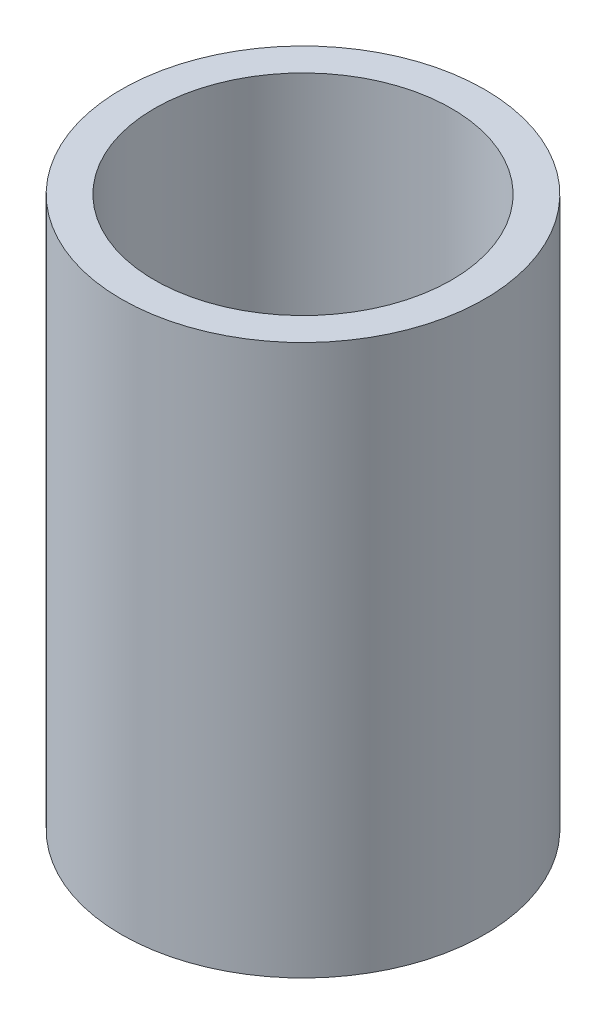
ISO-10303-21;
HEADER;
FILE_DESCRIPTION(('STEP AP214'),'2;1');
FILE_NAME('part.step','',(''),(''),'','','');
FILE_SCHEMA(('AUTOMOTIVE_DESIGN { 1 0 10303 214 1 1 1 1 }'));
ENDSEC;
DATA;
#1=APPLICATION_CONTEXT('core data for automotive mechanical design processes');
#2=APPLICATION_PROTOCOL_DEFINITION('international standard','automotive_design',2000,#1);
#3=PRODUCT_CONTEXT('',#1,'mechanical');
#4=PRODUCT('Part','Part','',(#3));
#5=PRODUCT_RELATED_PRODUCT_CATEGORY('part','',(#4));
#6=PRODUCT_DEFINITION_FORMATION('','',#4);
#7=PRODUCT_DEFINITION_CONTEXT('part definition',#1,'design');
#8=PRODUCT_DEFINITION('design','',#6,#7);
#9=PRODUCT_DEFINITION_SHAPE('','',#8);
#10=(LENGTH_UNIT() NAMED_UNIT(*) SI_UNIT(.MILLI.,.METRE.));
#11=(NAMED_UNIT(*) PLANE_ANGLE_UNIT() SI_UNIT($,.RADIAN.));
#12=(NAMED_UNIT(*) SI_UNIT($,.STERADIAN.) SOLID_ANGLE_UNIT());
#13=UNCERTAINTY_MEASURE_WITH_UNIT(LENGTH_MEASURE(1.E-05),#10,'distance_accuracy_value','');
#14=(GEOMETRIC_REPRESENTATION_CONTEXT(3) GLOBAL_UNCERTAINTY_ASSIGNED_CONTEXT((#13)) GLOBAL_UNIT_ASSIGNED_CONTEXT((#10,
#11,#12)) REPRESENTATION_CONTEXT('',''));
#15=CARTESIAN_POINT('',(0.,0.,0.));
#16=DIRECTION('',(0.,0.,1.));
#17=DIRECTION('',(1.,0.,0.));
#18=AXIS2_PLACEMENT_3D('',#15,#16,#17);
#19=CARTESIAN_POINT('',(0.,25.,0.));
#20=DIRECTION('',(0.,1.,0.));
#21=DIRECTION('',(0.,0.,1.));
#22=AXIS2_PLACEMENT_3D('',#19,#20,#21);
#23=PLANE('',#22);
#24=CARTESIAN_POINT('',(0.,25.,0.));
#25=DIRECTION('',(0.,1.,0.));
#26=DIRECTION('',(0.,0.,1.));
#27=AXIS2_PLACEMENT_3D('',#24,#25,#26);
#28=CIRCLE('',#27,16.5);
#29=CARTESIAN_POINT('',(0.,25.,16.5));
#30=VERTEX_POINT('',#29);
#31=EDGE_CURVE('E11',#30,#30,#28,.T.);
#32=ORIENTED_EDGE('',*,*,#31,.T.);
#33=EDGE_LOOP('',(#32));
#34=FACE_BOUND('',#33,.T.);
#35=CARTESIAN_POINT('',(0.,25.,0.));
#36=DIRECTION('',(0.,1.,0.));
#37=DIRECTION('',(1.,0.,0.));
#38=AXIS2_PLACEMENT_3D('',#35,#36,#37);
#39=CIRCLE('',#38,13.5);
#40=CARTESIAN_POINT('',(13.5,25.,0.));
#41=VERTEX_POINT('',#40);
#42=EDGE_CURVE('E49',#41,#41,#39,.T.);
#43=ORIENTED_EDGE('',*,*,#42,.F.);
#44=EDGE_LOOP('',(#43));
#45=FACE_BOUND('',#44,.T.);
#46=ADVANCED_FACE('F38',(#34,#45),#23,.T.);
#47=CARTESIAN_POINT('',(0.,-25.,0.));
#48=DIRECTION('',(0.,1.,0.));
#49=DIRECTION('',(0.,0.,1.));
#50=AXIS2_PLACEMENT_3D('',#47,#48,#49);
#51=PLANE('',#50);
#52=CARTESIAN_POINT('',(0.,-25.,0.));
#53=DIRECTION('',(0.,1.,0.));
#54=DIRECTION('',(0.,0.,1.));
#55=AXIS2_PLACEMENT_3D('',#52,#53,#54);
#56=CIRCLE('',#55,16.5);
#57=CARTESIAN_POINT('',(0.,-25.,16.5));
#58=VERTEX_POINT('',#57);
#59=EDGE_CURVE('E42',#58,#58,#56,.T.);
#60=ORIENTED_EDGE('',*,*,#59,.F.);
#61=EDGE_LOOP('',(#60));
#62=FACE_BOUND('',#61,.T.);
#63=CARTESIAN_POINT('',(0.,-25.,0.));
#64=DIRECTION('',(0.,1.,0.));
#65=DIRECTION('',(1.,0.,0.));
#66=AXIS2_PLACEMENT_3D('',#63,#64,#65);
#67=CIRCLE('',#66,13.5);
#68=CARTESIAN_POINT('',(13.5,-25.,0.));
#69=VERTEX_POINT('',#68);
#70=EDGE_CURVE('E51',#69,#69,#67,.T.);
#71=ORIENTED_EDGE('',*,*,#70,.T.);
#72=EDGE_LOOP('',(#71));
#73=FACE_BOUND('',#72,.T.);
#74=ADVANCED_FACE('F61',(#62,#73),#51,.F.);
#75=CARTESIAN_POINT('',(0.,25.,0.));
#76=DIRECTION('',(0.,-1.,0.));
#77=DIRECTION('',(0.,0.,-1.));
#78=AXIS2_PLACEMENT_3D('',#75,#76,#77);
#79=CYLINDRICAL_SURFACE('',#78,16.5);
#80=ORIENTED_EDGE('',*,*,#31,.F.);
#81=EDGE_LOOP('',(#80));
#82=FACE_BOUND('',#81,.T.);
#83=ORIENTED_EDGE('',*,*,#59,.T.);
#84=EDGE_LOOP('',(#83));
#85=FACE_BOUND('',#84,.T.);
#86=ADVANCED_FACE('F40',(#82,#85),#79,.T.);
#87=CARTESIAN_POINT('',(0.,25.,0.));
#88=DIRECTION('',(0.,-1.,0.));
#89=DIRECTION('',(0.,0.,-1.));
#90=AXIS2_PLACEMENT_3D('',#87,#88,#89);
#91=CYLINDRICAL_SURFACE('',#90,13.5);
#92=ORIENTED_EDGE('',*,*,#42,.T.);
#93=EDGE_LOOP('',(#92));
#94=FACE_BOUND('',#93,.T.);
#95=ORIENTED_EDGE('',*,*,#70,.F.);
#96=EDGE_LOOP('',(#95));
#97=FACE_BOUND('',#96,.T.);
#98=ADVANCED_FACE('F57',(#94,#97),#91,.F.);
#99=CLOSED_SHELL('',(#46,#74,#86,#98));
#100=MANIFOLD_SOLID_BREP('B2',#99);
#101=ADVANCED_BREP_SHAPE_REPRESENTATION('',(#18,#100),#14);
#102=SHAPE_DEFINITION_REPRESENTATION(#9,#101);
ENDSEC;
END-ISO-10303-21;
